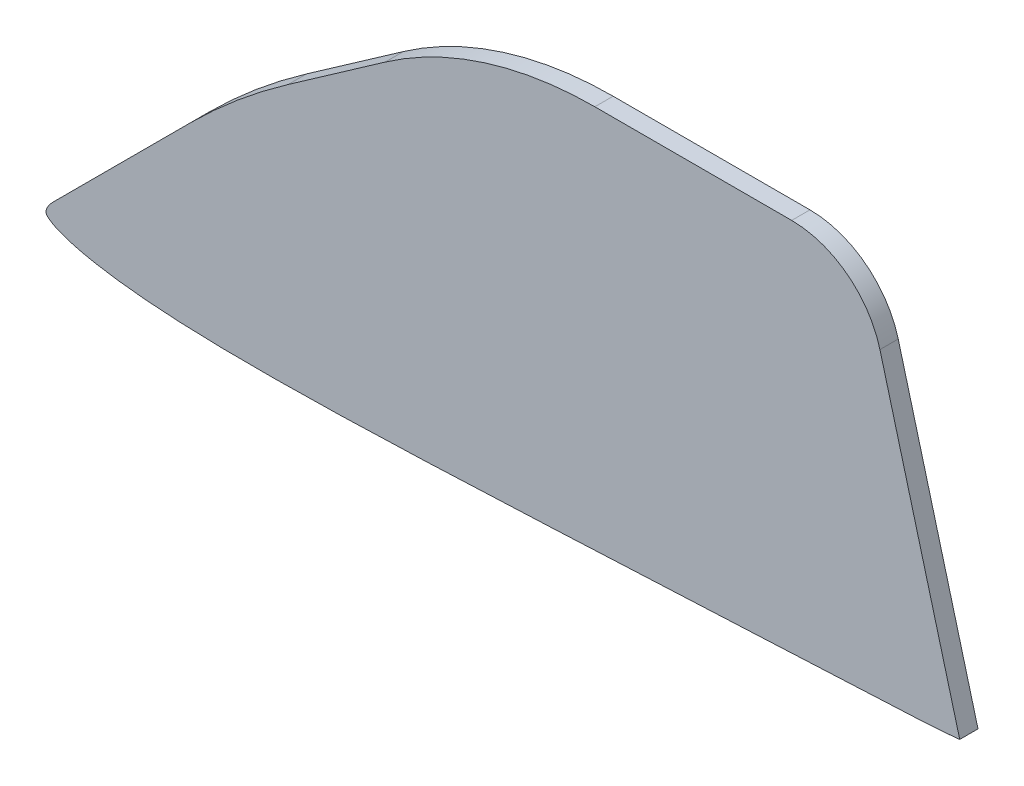
ISO-10303-21;
HEADER;
FILE_DESCRIPTION(('STEP AP214'),'2;1');
FILE_NAME('part.step','',(''),(''),'','','');
FILE_SCHEMA(('AUTOMOTIVE_DESIGN { 1 0 10303 214 1 1 1 1 }'));
ENDSEC;
DATA;
#1=APPLICATION_CONTEXT('core data for automotive mechanical design processes');
#2=APPLICATION_PROTOCOL_DEFINITION('international standard','automotive_design',2000,#1);
#3=PRODUCT_CONTEXT('',#1,'mechanical');
#4=PRODUCT('Part','Part','',(#3));
#5=PRODUCT_RELATED_PRODUCT_CATEGORY('part','',(#4));
#6=PRODUCT_DEFINITION_FORMATION('','',#4);
#7=PRODUCT_DEFINITION_CONTEXT('part definition',#1,'design');
#8=PRODUCT_DEFINITION('design','',#6,#7);
#9=PRODUCT_DEFINITION_SHAPE('','',#8);
#10=(LENGTH_UNIT() NAMED_UNIT(*) SI_UNIT(.MILLI.,.METRE.));
#11=(NAMED_UNIT(*) PLANE_ANGLE_UNIT() SI_UNIT($,.RADIAN.));
#12=(NAMED_UNIT(*) SI_UNIT($,.STERADIAN.) SOLID_ANGLE_UNIT());
#13=UNCERTAINTY_MEASURE_WITH_UNIT(LENGTH_MEASURE(1.E-05),#10,'distance_accuracy_value','');
#14=(GEOMETRIC_REPRESENTATION_CONTEXT(3) GLOBAL_UNCERTAINTY_ASSIGNED_CONTEXT((#13)) GLOBAL_UNIT_ASSIGNED_CONTEXT((#10,
#11,#12)) REPRESENTATION_CONTEXT('',''));
#15=CARTESIAN_POINT('',(0.,0.,0.));
#16=DIRECTION('',(0.,0.,1.));
#17=DIRECTION('',(1.,0.,0.));
#18=AXIS2_PLACEMENT_3D('',#15,#16,#17);
#19=CARTESIAN_POINT('',(109.727112292282,-109.727112292282,2.));
#20=DIRECTION('',(-0.707106781186546,0.707106781186549,0.));
#21=DIRECTION('',(-0.707106781186549,-0.707106781186546,0.));
#22=AXIS2_PLACEMENT_3D('',#19,#20,#21);
#23=PLANE('',#22);
#24=DIRECTION('',(0.707106781186549,0.707106781186546,0.));
#25=VECTOR('',#24,1.);
#26=CARTESIAN_POINT('',(109.727112292282,-109.727112292282,2.));
#27=LINE('',#26,#25);
#28=CARTESIAN_POINT('',(220.765620284372,1.31139569980736,2.));
#29=VERTEX_POINT('',#28);
#30=CARTESIAN_POINT('',(235.816514103882,16.362289519317,2.));
#31=VERTEX_POINT('',#30);
#32=EDGE_CURVE('E102',#29,#31,#27,.T.);
#33=ORIENTED_EDGE('',*,*,#32,.T.);
#34=DIRECTION('',(0.,0.,-1.));
#35=VECTOR('',#34,1.);
#36=CARTESIAN_POINT('',(235.816514103882,16.362289519317,2.));
#37=LINE('',#36,#35);
#38=CARTESIAN_POINT('',(235.816514103882,16.362289519317,0.));
#39=VERTEX_POINT('',#38);
#40=EDGE_CURVE('E163',#31,#39,#37,.T.);
#41=ORIENTED_EDGE('',*,*,#40,.T.);
#42=DIRECTION('',(0.707106781186549,0.707106781186546,0.));
#43=VECTOR('',#42,1.);
#44=CARTESIAN_POINT('',(109.727112292282,-109.727112292282,0.));
#45=LINE('',#44,#43);
#46=CARTESIAN_POINT('',(220.765620284372,1.31139569980736,0.));
#47=VERTEX_POINT('',#46);
#48=EDGE_CURVE('E104',#47,#39,#45,.T.);
#49=ORIENTED_EDGE('',*,*,#48,.F.);
#50=DIRECTION('',(0.,0.,-1.));
#51=VECTOR('',#50,1.);
#52=CARTESIAN_POINT('',(220.765620284372,1.31139569980736,2.));
#53=LINE('',#52,#51);
#54=EDGE_CURVE('E98',#29,#47,#53,.T.);
#55=ORIENTED_EDGE('',*,*,#54,.F.);
#56=EDGE_LOOP('',(#33,#41,#49,#55));
#57=FACE_BOUND('',#56,.T.);
#58=ADVANCED_FACE('F35',(#57),#23,.T.);
#59=CARTESIAN_POINT('',(320.,0.,2.));
#60=CARTESIAN_POINT('',(320.002223848205,0.00396402042260709,2.));
#61=CARTESIAN_POINT('',(319.277545308494,-0.030350145613459,2.));
#62=CARTESIAN_POINT('',(318.540849928549,-0.021289144698259,2.));
#63=CARTESIAN_POINT('',(316.730609528536,0.0123726677205478,2.));
#64=CARTESIAN_POINT('',(314.519797965409,0.143360762886391,2.));
#65=CARTESIAN_POINT('',(311.651253430829,0.364451856379536,2.));
#66=CARTESIAN_POINT('',(308.309813553255,0.706398368032162,2.));
#67=CARTESIAN_POINT('',(304.522347722807,1.16884164477641,2.));
#68=CARTESIAN_POINT('',(300.377512029503,1.73418777292704,2.));
#69=CARTESIAN_POINT('',(295.942957329569,2.38032858208463,2.));
#70=CARTESIAN_POINT('',(291.289295714072,3.07864374533829,2.));
#71=CARTESIAN_POINT('',(286.47947645197,3.79529649293966,2.));
#72=CARTESIAN_POINT('',(281.5653671373,4.48352909977451,2.));
#73=CARTESIAN_POINT('',(276.591145749252,5.11123571675764,2.));
#74=CARTESIAN_POINT('',(271.595315808583,5.65521320392397,2.));
#75=CARTESIAN_POINT('',(266.617100899179,6.10125002250183,2.));
#76=CARTESIAN_POINT('',(261.699110568437,6.44724646518417,2.));
#77=CARTESIAN_POINT('',(256.886849824121,6.68937788819907,2.));
#78=CARTESIAN_POINT('',(252.227145147412,6.82200797394566,2.));
#79=CARTESIAN_POINT('',(247.764503056037,6.84147268506767,2.));
#80=CARTESIAN_POINT('',(243.539032142872,6.73845271009382,2.));
#81=CARTESIAN_POINT('',(239.586033172579,6.51222449739396,2.));
#82=CARTESIAN_POINT('',(235.936354746626,6.16502435333979,2.));
#83=CARTESIAN_POINT('',(232.617889812738,5.7039188406289,2.));
#84=CARTESIAN_POINT('',(229.655292682031,5.13892981120532,2.));
#85=CARTESIAN_POINT('',(227.068635467997,4.48320517166652,2.));
#86=CARTESIAN_POINT('',(224.873145056655,3.74528044955531,2.));
#87=CARTESIAN_POINT('',(223.078225283666,2.94693727468274,2.));
#88=CARTESIAN_POINT('',(221.68537832771,2.11885218771944,2.));
#89=CARTESIAN_POINT('',(220.72726532153,1.3252168514911,2.));
#90=CARTESIAN_POINT('',(220.233799209883,0.706351653546718,2.));
#91=CARTESIAN_POINT('',(220.061642381831,0.318391358496842,2.));
#92=CARTESIAN_POINT('',(220.011602189089,0.139502642576719,2.));
#93=CARTESIAN_POINT('',(219.995925197364,-0.00286121123560432,2.));
#94=CARTESIAN_POINT('',(220.008120726699,-0.115534153632191,2.));
#95=CARTESIAN_POINT('',(220.062041001963,-0.21843611008133,2.));
#96=CARTESIAN_POINT('',(220.160266843951,-0.337962224388508,2.));
#97=CARTESIAN_POINT('',(220.314496951943,-0.4778619117342,2.));
#98=CARTESIAN_POINT('',(220.482600839168,-0.598911233088793,2.));
#99=CARTESIAN_POINT('',(220.942116034,-0.893723302436626,2.));
#100=CARTESIAN_POINT('',(221.892375738976,-1.2976144400845,2.));
#101=CARTESIAN_POINT('',(223.520457756137,-1.7840135234091,2.));
#102=CARTESIAN_POINT('',(225.623980895531,-2.227885385458,2.));
#103=CARTESIAN_POINT('',(228.177131144405,-2.61331525328566,2.));
#104=CARTESIAN_POINT('',(231.164121122883,-2.91918377253668,2.));
#105=CARTESIAN_POINT('',(234.563486569246,-3.13704421972334,2.));
#106=CARTESIAN_POINT('',(238.35201288317,-3.26707988589388,2.));
#107=CARTESIAN_POINT('',(242.499561210751,-3.31204073890104,2.));
#108=CARTESIAN_POINT('',(246.96894569995,-3.2849205051777,2.));
#109=CARTESIAN_POINT('',(251.715996005742,-3.19318617592934,2.));
#110=CARTESIAN_POINT('',(256.691386012588,-3.04761722768025,2.));
#111=CARTESIAN_POINT('',(261.841513678202,-2.85754187108876,2.));
#112=CARTESIAN_POINT('',(267.108766756574,-2.6382885973922,2.));
#113=CARTESIAN_POINT('',(272.431487903235,-2.39882227760571,2.));
#114=CARTESIAN_POINT('',(277.745717707099,-2.15149100915173,2.));
#115=CARTESIAN_POINT('',(282.986461690824,-1.90196639237273,2.));
#116=CARTESIAN_POINT('',(288.089354258917,-1.65842330081428,2.));
#117=CARTESIAN_POINT('',(292.991669652754,-1.42329026290306,2.));
#118=CARTESIAN_POINT('',(297.633381787181,-1.2019680706242,2.));
#119=CARTESIAN_POINT('',(301.957838567677,-0.995171112634351,2.));
#120=CARTESIAN_POINT('',(305.910274679925,-0.808454244916157,2.));
#121=CARTESIAN_POINT('',(309.445141672757,-0.639954362577362,2.));
#122=CARTESIAN_POINT('',(312.505114518854,-0.492661457760042,2.));
#123=CARTESIAN_POINT('',(315.089174530071,-0.35956198452577,2.));
#124=CARTESIAN_POINT('',(317.064072102358,-0.250243866424966,2.));
#125=CARTESIAN_POINT('',(318.66722853677,-0.135455891104671,2.));
#126=CARTESIAN_POINT('',(319.339876729794,-0.0630543822881171,2.));
#127=CARTESIAN_POINT('',(319.997867717822,-0.00380080352701927,2.));
#128=CARTESIAN_POINT('',(320.,0.,2.));
#129=B_SPLINE_CURVE_WITH_KNOTS('',3,(#59,#60,#61,#62,#63,#64,#65,#66,#67,#68,#69,#70,#71,#72,
#73,#74,#75,#76,#77,#78,#79,#80,#81,#82,#83,#84,#85,#86,#87,#88,#89,#90,#91,#92,#93,#94,#95,#96,
#97,#98,#99,#100,#101,#102,#103,#104,#105,#106,#107,#108,#109,#110,#111,#112,#113,#114,#115,
#116,#117,#118,#119,#120,#121,#122,#123,#124,#125,#126,#127,#128),.UNSPECIFIED.,.T.,.F.,(4,1,1,
1,1,1,1,1,1,1,1,1,1,1,1,1,1,1,1,1,1,1,1,1,1,1,1,1,1,1,1,1,1,1,1,1,1,1,1,1,1,1,1,1,1,1,1,1,1,1,1,
1,1,1,1,1,1,1,1,1,1,1,1,1,1,1,1,4),(0.,0.00164417449523972,0.00661694321426898,
0.0148617128273865,0.0261709239413339,0.0403216465741155,0.0570382815464179,0.075955064709778,
0.0966967944367453,0.118902617244138,0.142212996218807,0.166277713458774,0.190805558737605,
0.215581065788937,0.240407279101005,0.265106719323868,0.289479656725623,0.313300300013308,
0.336346037372721,0.358400456794295,0.379278327405494,0.39883290924543,0.416933444348773,
0.433471794702258,0.448353531878176,0.461506235123572,0.472899123043145,0.482558483445004,
0.49050494227117,0.496775026052057,0.500888992610304,0.502031933751303,0.503032491655825,
0.503621391375645,0.504143577057299,0.504679781863105,0.50531067692001,0.506426476477274,
0.507746345909831,0.508370254975982,0.514496901720774,0.522891546064653,0.533497445316218,
0.546244310358037,0.561059304312602,0.577878563913132,0.596602089713028,0.617103044024684,
0.639204159233918,0.662685633620834,0.687304871666431,0.712801248403095,0.738887215462826,
0.765254170836936,0.791582967277173,0.817548904489149,0.842831994424959,0.867120728154702,
0.890117967973518,0.91154374779072,0.931132077336456,0.948635558510503,0.963834134582229,
0.976537413927193,0.986586625579124,0.993888175034035,0.998423523707168,1.),.UNSPECIFIED.);
#130=DIRECTION('',(0.,0.,-1.));
#131=VECTOR('',#130,1.);
#132=SURFACE_OF_LINEAR_EXTRUSION('',#129,#131);
#133=CARTESIAN_POINT('',(320.,0.,0.));
#134=CARTESIAN_POINT('',(320.002223848205,0.00396402042260709,0.));
#135=CARTESIAN_POINT('',(319.277545308494,-0.030350145613459,0.));
#136=CARTESIAN_POINT('',(318.540849928549,-0.021289144698259,0.));
#137=CARTESIAN_POINT('',(316.730609528536,0.0123726677205478,0.));
#138=CARTESIAN_POINT('',(314.519797965409,0.143360762886391,0.));
#139=CARTESIAN_POINT('',(311.651253430829,0.364451856379536,0.));
#140=CARTESIAN_POINT('',(308.309813553255,0.706398368032162,0.));
#141=CARTESIAN_POINT('',(304.522347722807,1.16884164477641,0.));
#142=CARTESIAN_POINT('',(300.377512029503,1.73418777292704,0.));
#143=CARTESIAN_POINT('',(295.942957329569,2.38032858208463,0.));
#144=CARTESIAN_POINT('',(291.289295714072,3.07864374533829,0.));
#145=CARTESIAN_POINT('',(286.47947645197,3.79529649293966,0.));
#146=CARTESIAN_POINT('',(281.5653671373,4.48352909977451,0.));
#147=CARTESIAN_POINT('',(276.591145749252,5.11123571675764,0.));
#148=CARTESIAN_POINT('',(271.595315808583,5.65521320392397,0.));
#149=CARTESIAN_POINT('',(266.617100899179,6.10125002250183,0.));
#150=CARTESIAN_POINT('',(261.699110568437,6.44724646518417,0.));
#151=CARTESIAN_POINT('',(256.886849824121,6.68937788819907,0.));
#152=CARTESIAN_POINT('',(252.227145147412,6.82200797394566,0.));
#153=CARTESIAN_POINT('',(247.764503056037,6.84147268506767,0.));
#154=CARTESIAN_POINT('',(243.539032142872,6.73845271009382,0.));
#155=CARTESIAN_POINT('',(239.586033172579,6.51222449739396,0.));
#156=CARTESIAN_POINT('',(235.936354746626,6.16502435333979,0.));
#157=CARTESIAN_POINT('',(232.617889812738,5.7039188406289,0.));
#158=CARTESIAN_POINT('',(229.655292682031,5.13892981120532,0.));
#159=CARTESIAN_POINT('',(227.068635467997,4.48320517166652,0.));
#160=CARTESIAN_POINT('',(224.873145056655,3.74528044955531,0.));
#161=CARTESIAN_POINT('',(223.078225283666,2.94693727468274,0.));
#162=CARTESIAN_POINT('',(221.68537832771,2.11885218771944,0.));
#163=CARTESIAN_POINT('',(220.72726532153,1.3252168514911,0.));
#164=CARTESIAN_POINT('',(220.233799209883,0.706351653546718,0.));
#165=CARTESIAN_POINT('',(220.061642381831,0.318391358496842,0.));
#166=CARTESIAN_POINT('',(220.011602189089,0.139502642576719,0.));
#167=CARTESIAN_POINT('',(219.995925197364,-0.00286121123560432,0.));
#168=CARTESIAN_POINT('',(220.008120726699,-0.115534153632191,0.));
#169=CARTESIAN_POINT('',(220.062041001963,-0.21843611008133,0.));
#170=CARTESIAN_POINT('',(220.160266843951,-0.337962224388508,0.));
#171=CARTESIAN_POINT('',(220.314496951943,-0.4778619117342,0.));
#172=CARTESIAN_POINT('',(220.482600839168,-0.598911233088793,0.));
#173=CARTESIAN_POINT('',(220.942116034,-0.893723302436626,0.));
#174=CARTESIAN_POINT('',(221.892375738976,-1.2976144400845,0.));
#175=CARTESIAN_POINT('',(223.520457756137,-1.7840135234091,0.));
#176=CARTESIAN_POINT('',(225.623980895531,-2.227885385458,0.));
#177=CARTESIAN_POINT('',(228.177131144405,-2.61331525328566,0.));
#178=CARTESIAN_POINT('',(231.164121122883,-2.91918377253668,0.));
#179=CARTESIAN_POINT('',(234.563486569246,-3.13704421972334,0.));
#180=CARTESIAN_POINT('',(238.35201288317,-3.26707988589388,0.));
#181=CARTESIAN_POINT('',(242.499561210751,-3.31204073890104,0.));
#182=CARTESIAN_POINT('',(246.96894569995,-3.2849205051777,0.));
#183=CARTESIAN_POINT('',(251.715996005742,-3.19318617592934,0.));
#184=CARTESIAN_POINT('',(256.691386012588,-3.04761722768025,0.));
#185=CARTESIAN_POINT('',(261.841513678202,-2.85754187108876,0.));
#186=CARTESIAN_POINT('',(267.108766756574,-2.6382885973922,0.));
#187=CARTESIAN_POINT('',(272.431487903235,-2.39882227760571,0.));
#188=CARTESIAN_POINT('',(277.745717707099,-2.15149100915173,0.));
#189=CARTESIAN_POINT('',(282.986461690824,-1.90196639237273,0.));
#190=CARTESIAN_POINT('',(288.089354258917,-1.65842330081428,0.));
#191=CARTESIAN_POINT('',(292.991669652754,-1.42329026290306,0.));
#192=CARTESIAN_POINT('',(297.633381787181,-1.2019680706242,0.));
#193=CARTESIAN_POINT('',(301.957838567677,-0.995171112634351,0.));
#194=CARTESIAN_POINT('',(305.910274679925,-0.808454244916157,0.));
#195=CARTESIAN_POINT('',(309.445141672757,-0.639954362577362,0.));
#196=CARTESIAN_POINT('',(312.505114518854,-0.492661457760042,0.));
#197=CARTESIAN_POINT('',(315.089174530071,-0.35956198452577,0.));
#198=CARTESIAN_POINT('',(317.064072102358,-0.250243866424966,0.));
#199=CARTESIAN_POINT('',(318.66722853677,-0.135455891104671,0.));
#200=CARTESIAN_POINT('',(319.339876729794,-0.0630543822881171,0.));
#201=CARTESIAN_POINT('',(319.997867717822,-0.00380080352701927,0.));
#202=CARTESIAN_POINT('',(320.,0.,0.));
#203=B_SPLINE_CURVE_WITH_KNOTS('',3,(#133,#134,#135,#136,#137,#138,#139,#140,#141,#142,#143,
#144,#145,#146,#147,#148,#149,#150,#151,#152,#153,#154,#155,#156,#157,#158,#159,#160,#161,#162,
#163,#164,#165,#166,#167,#168,#169,#170,#171,#172,#173,#174,#175,#176,#177,#178,#179,#180,#181,
#182,#183,#184,#185,#186,#187,#188,#189,#190,#191,#192,#193,#194,#195,#196,#197,#198,#199,#200,
#201,#202),.UNSPECIFIED.,.T.,.F.,(4,1,1,1,1,1,1,1,1,1,1,1,1,1,1,1,1,1,1,1,1,1,1,1,1,1,1,1,1,1,1,
1,1,1,1,1,1,1,1,1,1,1,1,1,1,1,1,1,1,1,1,1,1,1,1,1,1,1,1,1,1,1,1,1,1,1,1,4),(0.,
0.00164417449523972,0.00661694321426898,0.0148617128273865,0.0261709239413339,
0.0403216465741155,0.0570382815464179,0.075955064709778,0.0966967944367453,0.118902617244138,
0.142212996218807,0.166277713458774,0.190805558737605,0.215581065788937,0.240407279101005,
0.265106719323868,0.289479656725623,0.313300300013308,0.336346037372721,0.358400456794295,
0.379278327405494,0.39883290924543,0.416933444348773,0.433471794702258,0.448353531878176,
0.461506235123572,0.472899123043145,0.482558483445004,0.49050494227117,0.496775026052057,
0.500888992610304,0.502031933751303,0.503032491655825,0.503621391375645,0.504143577057299,
0.504679781863105,0.50531067692001,0.506426476477274,0.507746345909831,0.508370254975982,
0.514496901720774,0.522891546064653,0.533497445316218,0.546244310358037,0.561059304312602,
0.577878563913132,0.596602089713028,0.617103044024684,0.639204159233918,0.662685633620834,
0.687304871666431,0.712801248403095,0.738887215462826,0.765254170836936,0.791582967277173,
0.817548904489149,0.842831994424959,0.867120728154702,0.890117967973518,0.91154374779072,
0.931132077336456,0.948635558510503,0.963834134582229,0.976537413927193,0.986586625579124,
0.993888175034035,0.998423523707168,1.),.UNSPECIFIED.);
#204=CARTESIAN_POINT('',(320.,0.,0.));
#205=VERTEX_POINT('',#204);
#206=EDGE_CURVE('E186',#47,#205,#203,.T.);
#207=ORIENTED_EDGE('',*,*,#206,.T.);
#208=DIRECTION('',(0.,0.,-1.));
#209=VECTOR('',#208,1.);
#210=CARTESIAN_POINT('',(320.,0.,2.));
#211=LINE('',#210,#209);
#212=CARTESIAN_POINT('',(320.,0.,2.));
#213=VERTEX_POINT('',#212);
#214=EDGE_CURVE('E109',#213,#205,#211,.T.);
#215=ORIENTED_EDGE('',*,*,#214,.F.);
#216=EDGE_CURVE('E113',#29,#213,#129,.T.);
#217=ORIENTED_EDGE('',*,*,#216,.F.);
#218=ORIENTED_EDGE('',*,*,#54,.T.);
#219=EDGE_LOOP('',(#207,#215,#217,#218));
#220=FACE_BOUND('',#219,.T.);
#221=ADVANCED_FACE('F114',(#220),#132,.F.);
#222=CARTESIAN_POINT('',(298.564064605511,79.9999999999983,2.));
#223=DIRECTION('',(0.96592582628907,0.258819045102515,0.));
#224=DIRECTION('',(-0.258819045102515,0.96592582628907,0.));
#225=AXIS2_PLACEMENT_3D('',#222,#223,#224);
#226=PLANE('',#225);
#227=DIRECTION('',(0.258819045102515,-0.96592582628907,0.));
#228=VECTOR('',#227,1.);
#229=CARTESIAN_POINT('',(298.564064605511,79.9999999999983,0.));
#230=LINE('',#229,#228);
#231=CARTESIAN_POINT('',(311.268020685856,32.5881904510251,0.));
#232=VERTEX_POINT('',#231);
#233=EDGE_CURVE('E184',#232,#205,#230,.T.);
#234=ORIENTED_EDGE('',*,*,#233,.F.);
#235=DIRECTION('',(0.,0.,-1.));
#236=VECTOR('',#235,1.);
#237=CARTESIAN_POINT('',(311.268020685856,32.5881904510251,2.));
#238=LINE('',#237,#236);
#239=CARTESIAN_POINT('',(311.268020685856,32.5881904510251,2.));
#240=VERTEX_POINT('',#239);
#241=EDGE_CURVE('E175',#232,#240,#238,.F.);
#242=ORIENTED_EDGE('',*,*,#241,.T.);
#243=DIRECTION('',(0.258819045102515,-0.96592582628907,0.));
#244=VECTOR('',#243,1.);
#245=CARTESIAN_POINT('',(298.564064605511,79.9999999999983,2.));
#246=LINE('',#245,#244);
#247=EDGE_CURVE('E118',#240,#213,#246,.T.);
#248=ORIENTED_EDGE('',*,*,#247,.T.);
#249=ORIENTED_EDGE('',*,*,#214,.T.);
#250=EDGE_LOOP('',(#234,#242,#248,#249));
#251=FACE_BOUND('',#250,.T.);
#252=ADVANCED_FACE('F138',(#251),#226,.T.);
#253=CARTESIAN_POINT('',(0.,40.,2.));
#254=DIRECTION('',(0.,1.,0.));
#255=DIRECTION('',(0.,0.,1.));
#256=AXIS2_PLACEMENT_3D('',#253,#254,#255);
#257=PLANE('',#256);
#258=DIRECTION('',(1.,0.,0.));
#259=VECTOR('',#258,1.);
#260=CARTESIAN_POINT('',(0.,40.,0.));
#261=LINE('',#260,#259);
#262=CARTESIAN_POINT('',(280.067664819644,40.,0.));
#263=VERTEX_POINT('',#262);
#264=CARTESIAN_POINT('',(301.608762422966,40.,0.));
#265=VERTEX_POINT('',#264);
#266=EDGE_CURVE('E124',#263,#265,#261,.T.);
#267=ORIENTED_EDGE('',*,*,#266,.F.);
#268=DIRECTION('',(0.,0.,-1.));
#269=VECTOR('',#268,1.);
#270=CARTESIAN_POINT('',(280.067664819644,40.,2.));
#271=LINE('',#270,#269);
#272=CARTESIAN_POINT('',(280.067664819644,40.,2.));
#273=VERTEX_POINT('',#272);
#274=EDGE_CURVE('E159',#263,#273,#271,.F.);
#275=ORIENTED_EDGE('',*,*,#274,.T.);
#276=DIRECTION('',(1.,0.,0.));
#277=VECTOR('',#276,1.);
#278=CARTESIAN_POINT('',(0.,40.,2.));
#279=LINE('',#278,#277);
#280=CARTESIAN_POINT('',(301.608762422966,40.,2.));
#281=VERTEX_POINT('',#280);
#282=EDGE_CURVE('E194',#273,#281,#279,.T.);
#283=ORIENTED_EDGE('',*,*,#282,.T.);
#284=DIRECTION('',(0.,0.,-1.));
#285=VECTOR('',#284,1.);
#286=CARTESIAN_POINT('',(301.608762422966,40.,2.));
#287=LINE('',#286,#285);
#288=EDGE_CURVE('E108',#281,#265,#287,.T.);
#289=ORIENTED_EDGE('',*,*,#288,.T.);
#290=EDGE_LOOP('',(#267,#275,#283,#289));
#291=FACE_BOUND('',#290,.T.);
#292=ADVANCED_FACE('F203',(#291),#257,.T.);
#293=CARTESIAN_POINT('',(69.1963835245296,-98.8226772043203,2.));
#294=DIRECTION('',(-0.573576436351044,0.819152044288993,0.));
#295=DIRECTION('',(-0.819152044288993,-0.573576436351044,0.));
#296=AXIS2_PLACEMENT_3D('',#293,#294,#295);
#297=PLANE('',#296);
#298=DIRECTION('',(0.819152044288993,0.573576436351044,0.));
#299=VECTOR('',#298,1.);
#300=CARTESIAN_POINT('',(69.1963835245296,-98.8226772043203,0.));
#301=LINE('',#300,#299);
#302=CARTESIAN_POINT('',(246.498941690722,25.3259105675125,0.));
#303=VERTEX_POINT('',#302);
#304=CARTESIAN_POINT('',(257.124607365602,32.7660817715597,0.));
#305=VERTEX_POINT('',#304);
#306=EDGE_CURVE('E122',#303,#305,#301,.T.);
#307=ORIENTED_EDGE('',*,*,#306,.F.);
#308=DIRECTION('',(0.,0.,-1.));
#309=VECTOR('',#308,1.);
#310=CARTESIAN_POINT('',(246.498941690722,25.3259105675125,2.));
#311=LINE('',#310,#309);
#312=CARTESIAN_POINT('',(246.498941690722,25.3259105675125,2.));
#313=VERTEX_POINT('',#312);
#314=EDGE_CURVE('E43',#303,#313,#311,.F.);
#315=ORIENTED_EDGE('',*,*,#314,.T.);
#316=DIRECTION('',(0.819152044288993,0.573576436351044,0.));
#317=VECTOR('',#316,1.);
#318=CARTESIAN_POINT('',(69.1963835245296,-98.8226772043203,2.));
#319=LINE('',#318,#317);
#320=CARTESIAN_POINT('',(257.124607365602,32.7660817715597,2.));
#321=VERTEX_POINT('',#320);
#322=EDGE_CURVE('E181',#313,#321,#319,.T.);
#323=ORIENTED_EDGE('',*,*,#322,.T.);
#324=DIRECTION('',(0.,0.,-1.));
#325=VECTOR('',#324,1.);
#326=CARTESIAN_POINT('',(257.124607365602,32.7660817715597,2.));
#327=LINE('',#326,#325);
#328=EDGE_CURVE('E161',#321,#305,#327,.T.);
#329=ORIENTED_EDGE('',*,*,#328,.T.);
#330=EDGE_LOOP('',(#307,#315,#323,#329));
#331=FACE_BOUND('',#330,.T.);
#332=ADVANCED_FACE('F204',(#331),#297,.T.);
#333=CARTESIAN_POINT('',(0.,0.,2.));
#334=DIRECTION('',(0.,0.,1.));
#335=DIRECTION('',(1.,0.,0.));
#336=AXIS2_PLACEMENT_3D('',#333,#334,#335);
#337=PLANE('',#336);
#338=ORIENTED_EDGE('',*,*,#322,.F.);
#339=CARTESIAN_POINT('',(292.385056598806,-40.2062529756069,2.));
#340=DIRECTION('',(0.,0.,1.));
#341=DIRECTION('',(1.,0.,0.));
#342=AXIS2_PLACEMENT_3D('',#339,#340,#341);
#343=CIRCLE('',#342,80.);
#344=EDGE_CURVE('E11',#313,#31,#343,.T.);
#345=ORIENTED_EDGE('',*,*,#344,.T.);
#346=ORIENTED_EDGE('',*,*,#32,.F.);
#347=ORIENTED_EDGE('',*,*,#216,.T.);
#348=ORIENTED_EDGE('',*,*,#247,.F.);
#349=CARTESIAN_POINT('',(301.608762422966,30.,2.));
#350=DIRECTION('',(0.,0.,1.));
#351=DIRECTION('',(1.,0.,0.));
#352=AXIS2_PLACEMENT_3D('',#349,#350,#351);
#353=CIRCLE('',#352,10.);
#354=EDGE_CURVE('E172',#240,#281,#353,.T.);
#355=ORIENTED_EDGE('',*,*,#354,.T.);
#356=ORIENTED_EDGE('',*,*,#282,.F.);
#357=CARTESIAN_POINT('',(280.067664819644,0.,2.));
#358=DIRECTION('',(0.,0.,1.));
#359=DIRECTION('',(1.,0.,0.));
#360=AXIS2_PLACEMENT_3D('',#357,#358,#359);
#361=CIRCLE('',#360,40.);
#362=EDGE_CURVE('E157',#273,#321,#361,.T.);
#363=ORIENTED_EDGE('',*,*,#362,.T.);
#364=EDGE_LOOP('',(#338,#345,#346,#347,#348,#355,#356,#363));
#365=FACE_BOUND('',#364,.T.);
#366=ADVANCED_FACE('F120',(#365),#337,.T.);
#367=CARTESIAN_POINT('',(0.,0.,0.));
#368=DIRECTION('',(0.,0.,1.));
#369=DIRECTION('',(1.,0.,0.));
#370=AXIS2_PLACEMENT_3D('',#367,#368,#369);
#371=PLANE('',#370);
#372=ORIENTED_EDGE('',*,*,#48,.T.);
#373=CARTESIAN_POINT('',(292.385056598806,-40.2062529756069,0.));
#374=DIRECTION('',(0.,0.,1.));
#375=DIRECTION('',(1.,0.,0.));
#376=AXIS2_PLACEMENT_3D('',#373,#374,#375);
#377=CIRCLE('',#376,80.);
#378=EDGE_CURVE('E57',#39,#303,#377,.F.);
#379=ORIENTED_EDGE('',*,*,#378,.T.);
#380=ORIENTED_EDGE('',*,*,#306,.T.);
#381=CARTESIAN_POINT('',(280.067664819644,0.,0.));
#382=DIRECTION('',(0.,0.,1.));
#383=DIRECTION('',(1.,0.,0.));
#384=AXIS2_PLACEMENT_3D('',#381,#382,#383);
#385=CIRCLE('',#384,40.);
#386=EDGE_CURVE('E166',#305,#263,#385,.F.);
#387=ORIENTED_EDGE('',*,*,#386,.T.);
#388=ORIENTED_EDGE('',*,*,#266,.T.);
#389=CARTESIAN_POINT('',(301.608762422966,30.,0.));
#390=DIRECTION('',(0.,0.,1.));
#391=DIRECTION('',(1.,0.,0.));
#392=AXIS2_PLACEMENT_3D('',#389,#390,#391);
#393=CIRCLE('',#392,10.);
#394=EDGE_CURVE('E177',#265,#232,#393,.F.);
#395=ORIENTED_EDGE('',*,*,#394,.T.);
#396=ORIENTED_EDGE('',*,*,#233,.T.);
#397=ORIENTED_EDGE('',*,*,#206,.F.);
#398=EDGE_LOOP('',(#372,#379,#380,#387,#388,#395,#396,#397));
#399=FACE_BOUND('',#398,.T.);
#400=ADVANCED_FACE('F145',(#399),#371,.F.);
#401=CARTESIAN_POINT('',(301.608762422966,30.,2.));
#402=DIRECTION('',(0.,0.,-1.));
#403=DIRECTION('',(-1.,0.,0.));
#404=AXIS2_PLACEMENT_3D('',#401,#402,#403);
#405=CYLINDRICAL_SURFACE('',#404,10.);
#406=ORIENTED_EDGE('',*,*,#354,.F.);
#407=ORIENTED_EDGE('',*,*,#241,.F.);
#408=ORIENTED_EDGE('',*,*,#394,.F.);
#409=ORIENTED_EDGE('',*,*,#288,.F.);
#410=EDGE_LOOP('',(#406,#407,#408,#409));
#411=FACE_BOUND('',#410,.T.);
#412=ADVANCED_FACE('F142',(#411),#405,.T.);
#413=CARTESIAN_POINT('',(280.067664819644,0.,2.));
#414=DIRECTION('',(0.,0.,-1.));
#415=DIRECTION('',(-1.,0.,0.));
#416=AXIS2_PLACEMENT_3D('',#413,#414,#415);
#417=CYLINDRICAL_SURFACE('',#416,40.);
#418=ORIENTED_EDGE('',*,*,#362,.F.);
#419=ORIENTED_EDGE('',*,*,#274,.F.);
#420=ORIENTED_EDGE('',*,*,#386,.F.);
#421=ORIENTED_EDGE('',*,*,#328,.F.);
#422=EDGE_LOOP('',(#418,#419,#420,#421));
#423=FACE_BOUND('',#422,.T.);
#424=ADVANCED_FACE('F144',(#423),#417,.T.);
#425=CARTESIAN_POINT('',(292.385056598806,-40.2062529756069,2.));
#426=DIRECTION('',(0.,0.,-1.));
#427=DIRECTION('',(-1.,0.,0.));
#428=AXIS2_PLACEMENT_3D('',#425,#426,#427);
#429=CYLINDRICAL_SURFACE('',#428,80.);
#430=ORIENTED_EDGE('',*,*,#344,.F.);
#431=ORIENTED_EDGE('',*,*,#314,.F.);
#432=ORIENTED_EDGE('',*,*,#378,.F.);
#433=ORIENTED_EDGE('',*,*,#40,.F.);
#434=EDGE_LOOP('',(#430,#431,#432,#433));
#435=FACE_BOUND('',#434,.T.);
#436=ADVANCED_FACE('F37',(#435),#429,.T.);
#437=CLOSED_SHELL('',(#58,#221,#252,#292,#332,#366,#400,#412,#424,#436));
#438=MANIFOLD_SOLID_BREP('B2',#437);
#439=ADVANCED_BREP_SHAPE_REPRESENTATION('',(#18,#438),#14);
#440=SHAPE_DEFINITION_REPRESENTATION(#9,#439);
ENDSEC;
END-ISO-10303-21;
